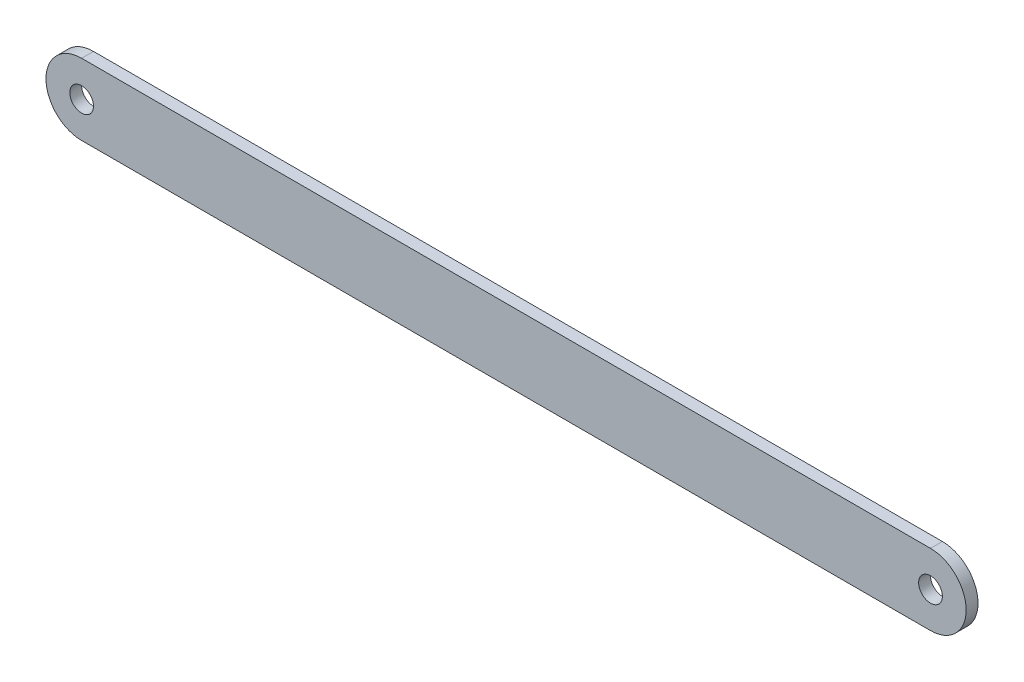
ISO-10303-21;
HEADER;
FILE_DESCRIPTION(('STEP AP214'),'2;1');
FILE_NAME('part.step','',(''),(''),'','','');
FILE_SCHEMA(('AUTOMOTIVE_DESIGN { 1 0 10303 214 1 1 1 1 }'));
ENDSEC;
DATA;
#1=APPLICATION_CONTEXT('core data for automotive mechanical design processes');
#2=APPLICATION_PROTOCOL_DEFINITION('international standard','automotive_design',2000,#1);
#3=PRODUCT_CONTEXT('',#1,'mechanical');
#4=PRODUCT('Part','Part','',(#3));
#5=PRODUCT_RELATED_PRODUCT_CATEGORY('part','',(#4));
#6=PRODUCT_DEFINITION_FORMATION('','',#4);
#7=PRODUCT_DEFINITION_CONTEXT('part definition',#1,'design');
#8=PRODUCT_DEFINITION('design','',#6,#7);
#9=PRODUCT_DEFINITION_SHAPE('','',#8);
#10=(LENGTH_UNIT() NAMED_UNIT(*) SI_UNIT(.MILLI.,.METRE.));
#11=(NAMED_UNIT(*) PLANE_ANGLE_UNIT() SI_UNIT($,.RADIAN.));
#12=(NAMED_UNIT(*) SI_UNIT($,.STERADIAN.) SOLID_ANGLE_UNIT());
#13=UNCERTAINTY_MEASURE_WITH_UNIT(LENGTH_MEASURE(1.E-05),#10,'distance_accuracy_value','');
#14=(GEOMETRIC_REPRESENTATION_CONTEXT(3) GLOBAL_UNCERTAINTY_ASSIGNED_CONTEXT((#13)) GLOBAL_UNIT_ASSIGNED_CONTEXT((#10,
#11,#12)) REPRESENTATION_CONTEXT('',''));
#15=CARTESIAN_POINT('',(0.,0.,0.));
#16=DIRECTION('',(0.,0.,1.));
#17=DIRECTION('',(1.,0.,0.));
#18=AXIS2_PLACEMENT_3D('',#15,#16,#17);
#19=CARTESIAN_POINT('',(-71.5,0.,2.));
#20=DIRECTION('',(0.,0.,1.));
#21=DIRECTION('',(1.,0.,0.));
#22=AXIS2_PLACEMENT_3D('',#19,#20,#21);
#23=PLANE('',#22);
#24=CARTESIAN_POINT('',(-71.5,0.,2.));
#25=DIRECTION('',(0.,0.,1.));
#26=DIRECTION('',(1.,0.,0.));
#27=AXIS2_PLACEMENT_3D('',#24,#25,#26);
#28=CIRCLE('',#27,2.);
#29=CARTESIAN_POINT('',(-69.5,0.,2.));
#30=VERTEX_POINT('',#29);
#31=EDGE_CURVE('E112',#30,#30,#28,.T.);
#32=ORIENTED_EDGE('',*,*,#31,.F.);
#33=EDGE_LOOP('',(#32));
#34=FACE_BOUND('',#33,.T.);
#35=CARTESIAN_POINT('',(-71.5,0.,2.));
#36=DIRECTION('',(0.,0.,1.));
#37=DIRECTION('',(1.,0.,0.));
#38=AXIS2_PLACEMENT_3D('',#35,#36,#37);
#39=CIRCLE('',#38,6.);
#40=CARTESIAN_POINT('',(-71.5,6.,2.));
#41=VERTEX_POINT('',#40);
#42=CARTESIAN_POINT('',(-71.5,-6.,2.));
#43=VERTEX_POINT('',#42);
#44=EDGE_CURVE('E92',#41,#43,#39,.T.);
#45=ORIENTED_EDGE('',*,*,#44,.T.);
#46=DIRECTION('',(1.,0.,0.));
#47=VECTOR('',#46,1.);
#48=CARTESIAN_POINT('',(-71.5,-6.,2.));
#49=LINE('',#48,#47);
#50=CARTESIAN_POINT('',(71.5,-5.99999999999997,2.));
#51=VERTEX_POINT('',#50);
#52=EDGE_CURVE('E87',#43,#51,#49,.T.);
#53=ORIENTED_EDGE('',*,*,#52,.T.);
#54=CARTESIAN_POINT('',(71.5,0.,2.));
#55=DIRECTION('',(0.,0.,1.));
#56=DIRECTION('',(1.,0.,0.));
#57=AXIS2_PLACEMENT_3D('',#54,#55,#56);
#58=CIRCLE('',#57,6.);
#59=CARTESIAN_POINT('',(71.5,6.00000000000003,2.));
#60=VERTEX_POINT('',#59);
#61=EDGE_CURVE('E90',#51,#60,#58,.T.);
#62=ORIENTED_EDGE('',*,*,#61,.T.);
#63=DIRECTION('',(-1.,0.,0.));
#64=VECTOR('',#63,1.);
#65=CARTESIAN_POINT('',(-71.5,6.,2.));
#66=LINE('',#65,#64);
#67=EDGE_CURVE('E57',#60,#41,#66,.T.);
#68=ORIENTED_EDGE('',*,*,#67,.T.);
#69=EDGE_LOOP('',(#45,#53,#62,#68));
#70=FACE_BOUND('',#69,.T.);
#71=CARTESIAN_POINT('',(71.5,0.,2.));
#72=DIRECTION('',(0.,0.,1.));
#73=DIRECTION('',(1.,0.,0.));
#74=AXIS2_PLACEMENT_3D('',#71,#72,#73);
#75=CIRCLE('',#74,2.);
#76=CARTESIAN_POINT('',(73.5,0.,2.));
#77=VERTEX_POINT('',#76);
#78=EDGE_CURVE('E134',#77,#77,#75,.T.);
#79=ORIENTED_EDGE('',*,*,#78,.F.);
#80=EDGE_LOOP('',(#79));
#81=FACE_BOUND('',#80,.T.);
#82=ADVANCED_FACE('F39',(#34,#70,#81),#23,.T.);
#83=CARTESIAN_POINT('',(-71.5,0.,0.));
#84=DIRECTION('',(0.,0.,1.));
#85=DIRECTION('',(1.,0.,0.));
#86=AXIS2_PLACEMENT_3D('',#83,#84,#85);
#87=PLANE('',#86);
#88=CARTESIAN_POINT('',(-71.5,0.,0.));
#89=DIRECTION('',(0.,0.,1.));
#90=DIRECTION('',(1.,0.,0.));
#91=AXIS2_PLACEMENT_3D('',#88,#89,#90);
#92=CIRCLE('',#91,6.);
#93=CARTESIAN_POINT('',(-71.5,6.,0.));
#94=VERTEX_POINT('',#93);
#95=CARTESIAN_POINT('',(-71.5,-6.,0.));
#96=VERTEX_POINT('',#95);
#97=EDGE_CURVE('E108',#94,#96,#92,.T.);
#98=ORIENTED_EDGE('',*,*,#97,.F.);
#99=DIRECTION('',(-1.,0.,0.));
#100=VECTOR('',#99,1.);
#101=CARTESIAN_POINT('',(-71.5,6.,0.));
#102=LINE('',#101,#100);
#103=CARTESIAN_POINT('',(71.5,6.00000000000003,0.));
#104=VERTEX_POINT('',#103);
#105=EDGE_CURVE('E80',#104,#94,#102,.T.);
#106=ORIENTED_EDGE('',*,*,#105,.F.);
#107=CARTESIAN_POINT('',(71.5,0.,0.));
#108=DIRECTION('',(0.,0.,1.));
#109=DIRECTION('',(1.,0.,0.));
#110=AXIS2_PLACEMENT_3D('',#107,#108,#109);
#111=CIRCLE('',#110,6.);
#112=CARTESIAN_POINT('',(71.5,-5.99999999999997,0.));
#113=VERTEX_POINT('',#112);
#114=EDGE_CURVE('E74',#113,#104,#111,.T.);
#115=ORIENTED_EDGE('',*,*,#114,.F.);
#116=DIRECTION('',(1.,0.,0.));
#117=VECTOR('',#116,1.);
#118=CARTESIAN_POINT('',(-71.5,-6.,0.));
#119=LINE('',#118,#117);
#120=EDGE_CURVE('E97',#96,#113,#119,.T.);
#121=ORIENTED_EDGE('',*,*,#120,.F.);
#122=EDGE_LOOP('',(#98,#106,#115,#121));
#123=FACE_BOUND('',#122,.T.);
#124=CARTESIAN_POINT('',(-71.5,0.,0.));
#125=DIRECTION('',(0.,0.,1.));
#126=DIRECTION('',(1.,0.,0.));
#127=AXIS2_PLACEMENT_3D('',#124,#125,#126);
#128=CIRCLE('',#127,2.);
#129=CARTESIAN_POINT('',(-69.5,0.,0.));
#130=VERTEX_POINT('',#129);
#131=EDGE_CURVE('E130',#130,#130,#128,.T.);
#132=ORIENTED_EDGE('',*,*,#131,.T.);
#133=EDGE_LOOP('',(#132));
#134=FACE_BOUND('',#133,.T.);
#135=CARTESIAN_POINT('',(71.5,0.,0.));
#136=DIRECTION('',(0.,0.,1.));
#137=DIRECTION('',(1.,0.,0.));
#138=AXIS2_PLACEMENT_3D('',#135,#136,#137);
#139=CIRCLE('',#138,2.);
#140=CARTESIAN_POINT('',(73.5,0.,0.));
#141=VERTEX_POINT('',#140);
#142=EDGE_CURVE('E138',#141,#141,#139,.T.);
#143=ORIENTED_EDGE('',*,*,#142,.T.);
#144=EDGE_LOOP('',(#143));
#145=FACE_BOUND('',#144,.T.);
#146=ADVANCED_FACE('F125',(#123,#134,#145),#87,.F.);
#147=CARTESIAN_POINT('',(-71.5,0.,2.));
#148=DIRECTION('',(0.,0.,-1.));
#149=DIRECTION('',(-1.,0.,0.));
#150=AXIS2_PLACEMENT_3D('',#147,#148,#149);
#151=CYLINDRICAL_SURFACE('',#150,6.);
#152=ORIENTED_EDGE('',*,*,#97,.T.);
#153=DIRECTION('',(0.,0.,-1.));
#154=VECTOR('',#153,1.);
#155=CARTESIAN_POINT('',(-71.5,-6.,2.));
#156=LINE('',#155,#154);
#157=EDGE_CURVE('E11',#43,#96,#156,.T.);
#158=ORIENTED_EDGE('',*,*,#157,.F.);
#159=ORIENTED_EDGE('',*,*,#44,.F.);
#160=DIRECTION('',(0.,0.,-1.));
#161=VECTOR('',#160,1.);
#162=CARTESIAN_POINT('',(-71.5,6.,2.));
#163=LINE('',#162,#161);
#164=EDGE_CURVE('E104',#41,#94,#163,.T.);
#165=ORIENTED_EDGE('',*,*,#164,.T.);
#166=EDGE_LOOP('',(#152,#158,#159,#165));
#167=FACE_BOUND('',#166,.T.);
#168=ADVANCED_FACE('F41',(#167),#151,.T.);
#169=CARTESIAN_POINT('',(-71.5,-6.,2.));
#170=DIRECTION('',(0.,1.,0.));
#171=DIRECTION('',(-1.,0.,0.));
#172=AXIS2_PLACEMENT_3D('',#169,#170,#171);
#173=PLANE('',#172);
#174=ORIENTED_EDGE('',*,*,#120,.T.);
#175=DIRECTION('',(0.,0.,-1.));
#176=VECTOR('',#175,1.);
#177=CARTESIAN_POINT('',(71.5,-5.99999999999997,2.));
#178=LINE('',#177,#176);
#179=EDGE_CURVE('E49',#51,#113,#178,.T.);
#180=ORIENTED_EDGE('',*,*,#179,.F.);
#181=ORIENTED_EDGE('',*,*,#52,.F.);
#182=ORIENTED_EDGE('',*,*,#157,.T.);
#183=EDGE_LOOP('',(#174,#180,#181,#182));
#184=FACE_BOUND('',#183,.T.);
#185=ADVANCED_FACE('F96',(#184),#173,.F.);
#186=CARTESIAN_POINT('',(71.5,0.,2.));
#187=DIRECTION('',(0.,0.,-1.));
#188=DIRECTION('',(-1.,0.,0.));
#189=AXIS2_PLACEMENT_3D('',#186,#187,#188);
#190=CYLINDRICAL_SURFACE('',#189,6.);
#191=ORIENTED_EDGE('',*,*,#114,.T.);
#192=DIRECTION('',(0.,0.,-1.));
#193=VECTOR('',#192,1.);
#194=CARTESIAN_POINT('',(71.5,6.00000000000003,2.));
#195=LINE('',#194,#193);
#196=EDGE_CURVE('E99',#60,#104,#195,.T.);
#197=ORIENTED_EDGE('',*,*,#196,.F.);
#198=ORIENTED_EDGE('',*,*,#61,.F.);
#199=ORIENTED_EDGE('',*,*,#179,.T.);
#200=EDGE_LOOP('',(#191,#197,#198,#199));
#201=FACE_BOUND('',#200,.T.);
#202=ADVANCED_FACE('F100',(#201),#190,.T.);
#203=CARTESIAN_POINT('',(-71.5,6.,2.));
#204=DIRECTION('',(0.,-1.,0.));
#205=DIRECTION('',(1.,0.,0.));
#206=AXIS2_PLACEMENT_3D('',#203,#204,#205);
#207=PLANE('',#206);
#208=ORIENTED_EDGE('',*,*,#105,.T.);
#209=ORIENTED_EDGE('',*,*,#164,.F.);
#210=ORIENTED_EDGE('',*,*,#67,.F.);
#211=ORIENTED_EDGE('',*,*,#196,.T.);
#212=EDGE_LOOP('',(#208,#209,#210,#211));
#213=FACE_BOUND('',#212,.T.);
#214=ADVANCED_FACE('F122',(#213),#207,.F.);
#215=CARTESIAN_POINT('',(-71.5,0.,2.));
#216=DIRECTION('',(0.,0.,-1.));
#217=DIRECTION('',(-1.,0.,0.));
#218=AXIS2_PLACEMENT_3D('',#215,#216,#217);
#219=CYLINDRICAL_SURFACE('',#218,2.);
#220=ORIENTED_EDGE('',*,*,#31,.T.);
#221=EDGE_LOOP('',(#220));
#222=FACE_BOUND('',#221,.T.);
#223=ORIENTED_EDGE('',*,*,#131,.F.);
#224=EDGE_LOOP('',(#223));
#225=FACE_BOUND('',#224,.T.);
#226=ADVANCED_FACE('F157',(#222,#225),#219,.F.);
#227=CARTESIAN_POINT('',(71.5,0.,2.));
#228=DIRECTION('',(0.,0.,-1.));
#229=DIRECTION('',(-1.,0.,0.));
#230=AXIS2_PLACEMENT_3D('',#227,#228,#229);
#231=CYLINDRICAL_SURFACE('',#230,2.);
#232=ORIENTED_EDGE('',*,*,#78,.T.);
#233=EDGE_LOOP('',(#232));
#234=FACE_BOUND('',#233,.T.);
#235=ORIENTED_EDGE('',*,*,#142,.F.);
#236=EDGE_LOOP('',(#235));
#237=FACE_BOUND('',#236,.T.);
#238=ADVANCED_FACE('F146',(#234,#237),#231,.F.);
#239=CLOSED_SHELL('',(#82,#146,#168,#185,#202,#214,#226,#238));
#240=MANIFOLD_SOLID_BREP('B2',#239);
#241=ADVANCED_BREP_SHAPE_REPRESENTATION('',(#18,#240),#14);
#242=SHAPE_DEFINITION_REPRESENTATION(#9,#241);
ENDSEC;
END-ISO-10303-21;
